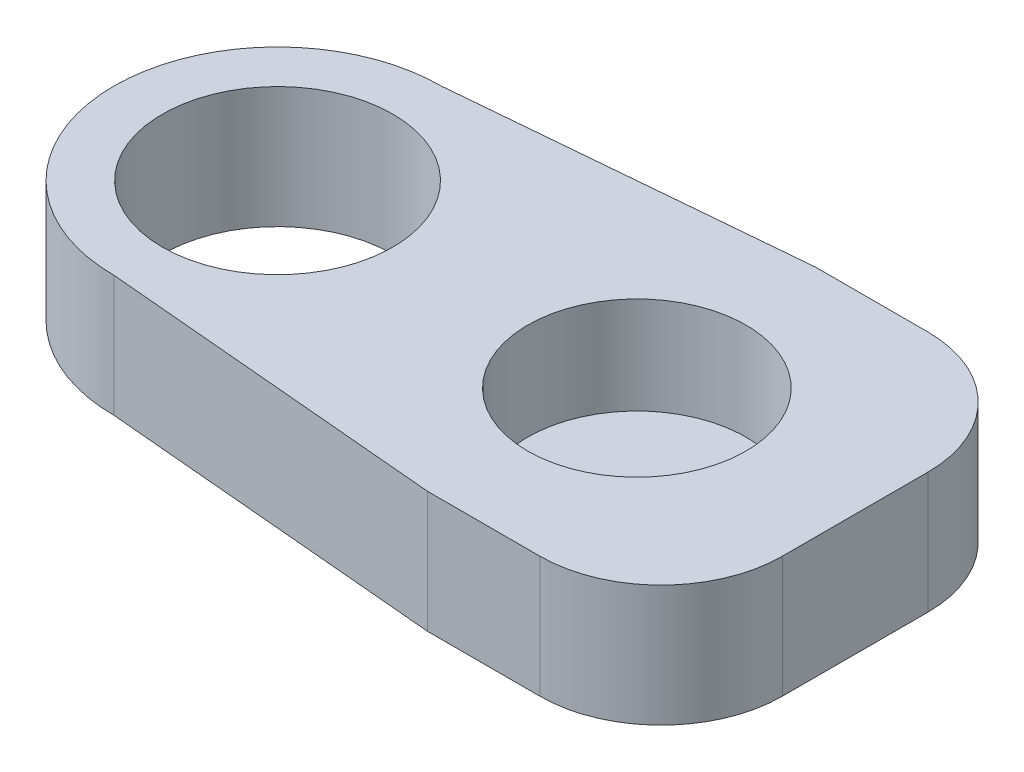
ISO-10303-21;
HEADER;
FILE_DESCRIPTION(('STEP AP214'),'2;1');
FILE_NAME('part.step','',(''),(''),'','','');
FILE_SCHEMA(('AUTOMOTIVE_DESIGN { 1 0 10303 214 1 1 1 1 }'));
ENDSEC;
DATA;
#1=APPLICATION_CONTEXT('core data for automotive mechanical design processes');
#2=APPLICATION_PROTOCOL_DEFINITION('international standard','automotive_design',2000,#1);
#3=PRODUCT_CONTEXT('',#1,'mechanical');
#4=PRODUCT('Part','Part','',(#3));
#5=PRODUCT_RELATED_PRODUCT_CATEGORY('part','',(#4));
#6=PRODUCT_DEFINITION_FORMATION('','',#4);
#7=PRODUCT_DEFINITION_CONTEXT('part definition',#1,'design');
#8=PRODUCT_DEFINITION('design','',#6,#7);
#9=PRODUCT_DEFINITION_SHAPE('','',#8);
#10=(LENGTH_UNIT() NAMED_UNIT(*) SI_UNIT(.MILLI.,.METRE.));
#11=(NAMED_UNIT(*) PLANE_ANGLE_UNIT() SI_UNIT($,.RADIAN.));
#12=(NAMED_UNIT(*) SI_UNIT($,.STERADIAN.) SOLID_ANGLE_UNIT());
#13=UNCERTAINTY_MEASURE_WITH_UNIT(LENGTH_MEASURE(1.E-05),#10,'distance_accuracy_value','');
#14=(GEOMETRIC_REPRESENTATION_CONTEXT(3) GLOBAL_UNCERTAINTY_ASSIGNED_CONTEXT((#13)) GLOBAL_UNIT_ASSIGNED_CONTEXT((#10,
#11,#12)) REPRESENTATION_CONTEXT('',''));
#15=CARTESIAN_POINT('',(0.,0.,0.));
#16=DIRECTION('',(0.,0.,1.));
#17=DIRECTION('',(1.,0.,0.));
#18=AXIS2_PLACEMENT_3D('',#15,#16,#17);
#19=CARTESIAN_POINT('',(-0.656258948967261,5.,-7.44412914173938));
#20=DIRECTION('',(0.0878173312896641,0.,0.996136595214312));
#21=DIRECTION('',(0.996136595214312,0.,-0.0878173312896641));
#22=AXIS2_PLACEMENT_3D('',#19,#20,#21);
#23=PLANE('',#22);
#24=DIRECTION('',(-0.996136595214312,0.,0.0878173312896641));
#25=VECTOR('',#24,1.);
#26=CARTESIAN_POINT('',(-0.656258948967261,0.,-7.44412914173938));
#27=LINE('',#26,#25);
#28=CARTESIAN_POINT('',(5.64913995116722,0.,-8.));
#29=VERTEX_POINT('',#28);
#30=CARTESIAN_POINT('',(-8.52996029853992,0.,-6.75));
#31=VERTEX_POINT('',#30);
#32=EDGE_CURVE('E142',#29,#31,#27,.T.);
#33=ORIENTED_EDGE('',*,*,#32,.T.);
#34=DIRECTION('',(0.,-1.,0.));
#35=VECTOR('',#34,1.);
#36=CARTESIAN_POINT('',(-8.52996029853992,5.,-6.75));
#37=LINE('',#36,#35);
#38=CARTESIAN_POINT('',(-8.52996029853992,5.,-6.75));
#39=VERTEX_POINT('',#38);
#40=EDGE_CURVE('E11',#39,#31,#37,.T.);
#41=ORIENTED_EDGE('',*,*,#40,.F.);
#42=DIRECTION('',(-0.996136595214312,0.,0.0878173312896641));
#43=VECTOR('',#42,1.);
#44=CARTESIAN_POINT('',(-0.656258948967261,5.,-7.44412914173938));
#45=LINE('',#44,#43);
#46=CARTESIAN_POINT('',(5.64913995116722,5.,-8.));
#47=VERTEX_POINT('',#46);
#48=EDGE_CURVE('E169',#47,#39,#45,.T.);
#49=ORIENTED_EDGE('',*,*,#48,.F.);
#50=DIRECTION('',(0.,-1.,0.));
#51=VECTOR('',#50,1.);
#52=CARTESIAN_POINT('',(5.64913995116722,5.,-8.));
#53=LINE('',#52,#51);
#54=EDGE_CURVE('E52',#47,#29,#53,.T.);
#55=ORIENTED_EDGE('',*,*,#54,.T.);
#56=EDGE_LOOP('',(#33,#41,#49,#55));
#57=FACE_BOUND('',#56,.T.);
#58=ADVANCED_FACE('F36',(#57),#23,.F.);
#59=CARTESIAN_POINT('',(-8.52998014926995,5.,1.9850730054085E-05));
#60=DIRECTION('',(0.,-1.,0.));
#61=DIRECTION('',(0.,0.,-1.));
#62=AXIS2_PLACEMENT_3D('',#59,#60,#61);
#63=CYLINDRICAL_SURFACE('',#62,6.75001985075924);
#64=CARTESIAN_POINT('',(-8.52998014926995,0.,1.9850730054085E-05));
#65=DIRECTION('',(0.,1.,0.));
#66=DIRECTION('',(0.,0.,1.));
#67=AXIS2_PLACEMENT_3D('',#64,#65,#66);
#68=CIRCLE('',#67,6.75001985075924);
#69=CARTESIAN_POINT('',(-15.28,0.,0.));
#70=VERTEX_POINT('',#69);
#71=EDGE_CURVE('E144',#31,#70,#68,.T.);
#72=ORIENTED_EDGE('',*,*,#71,.T.);
#73=DIRECTION('',(0.,-1.,0.));
#74=VECTOR('',#73,1.);
#75=CARTESIAN_POINT('',(-15.28,5.,0.));
#76=LINE('',#75,#74);
#77=CARTESIAN_POINT('',(-15.28,5.,0.));
#78=VERTEX_POINT('',#77);
#79=EDGE_CURVE('E44',#78,#70,#76,.T.);
#80=ORIENTED_EDGE('',*,*,#79,.F.);
#81=CARTESIAN_POINT('',(-8.52998014926995,5.,1.9850730054085E-05));
#82=DIRECTION('',(0.,1.,0.));
#83=DIRECTION('',(0.,0.,1.));
#84=AXIS2_PLACEMENT_3D('',#81,#82,#83);
#85=CIRCLE('',#84,6.75001985075924);
#86=EDGE_CURVE('E94',#39,#78,#85,.T.);
#87=ORIENTED_EDGE('',*,*,#86,.F.);
#88=ORIENTED_EDGE('',*,*,#40,.T.);
#89=EDGE_LOOP('',(#72,#80,#87,#88));
#90=FACE_BOUND('',#89,.T.);
#91=ADVANCED_FACE('F184',(#90),#63,.T.);
#92=CARTESIAN_POINT('',(-8.52998014926995,5.,-1.9850730054085E-05));
#93=DIRECTION('',(0.,-1.,0.));
#94=DIRECTION('',(0.,0.,-1.));
#95=AXIS2_PLACEMENT_3D('',#92,#93,#94);
#96=CYLINDRICAL_SURFACE('',#95,6.75001985075924);
#97=CARTESIAN_POINT('',(-8.52998014926995,0.,-1.9850730054085E-05));
#98=DIRECTION('',(0.,1.,0.));
#99=DIRECTION('',(0.,0.,1.));
#100=AXIS2_PLACEMENT_3D('',#97,#98,#99);
#101=CIRCLE('',#100,6.75001985075924);
#102=CARTESIAN_POINT('',(-8.52996029853992,0.,6.75));
#103=VERTEX_POINT('',#102);
#104=EDGE_CURVE('E148',#103,#70,#101,.F.);
#105=ORIENTED_EDGE('',*,*,#104,.F.);
#106=DIRECTION('',(0.,-1.,0.));
#107=VECTOR('',#106,1.);
#108=CARTESIAN_POINT('',(-8.52996029853992,5.,6.75));
#109=LINE('',#108,#107);
#110=CARTESIAN_POINT('',(-8.52996029853992,5.,6.75));
#111=VERTEX_POINT('',#110);
#112=EDGE_CURVE('E177',#111,#103,#109,.T.);
#113=ORIENTED_EDGE('',*,*,#112,.F.);
#114=CARTESIAN_POINT('',(-8.52998014926995,5.,-1.9850730054085E-05));
#115=DIRECTION('',(0.,1.,0.));
#116=DIRECTION('',(0.,0.,1.));
#117=AXIS2_PLACEMENT_3D('',#114,#115,#116);
#118=CIRCLE('',#117,6.75001985075924);
#119=EDGE_CURVE('E183',#111,#78,#118,.F.);
#120=ORIENTED_EDGE('',*,*,#119,.T.);
#121=ORIENTED_EDGE('',*,*,#79,.T.);
#122=EDGE_LOOP('',(#105,#113,#120,#121));
#123=FACE_BOUND('',#122,.T.);
#124=ADVANCED_FACE('F181',(#123),#96,.T.);
#125=CARTESIAN_POINT('',(-0.656258948967261,5.,7.44412914173938));
#126=DIRECTION('',(-0.0878173312896641,0.,0.996136595214312));
#127=DIRECTION('',(0.996136595214312,0.,0.0878173312896641));
#128=AXIS2_PLACEMENT_3D('',#125,#126,#127);
#129=PLANE('',#128);
#130=DIRECTION('',(-0.996136595214312,0.,-0.0878173312896641));
#131=VECTOR('',#130,1.);
#132=CARTESIAN_POINT('',(-0.656258948967261,0.,7.44412914173938));
#133=LINE('',#132,#131);
#134=CARTESIAN_POINT('',(5.64913995116722,0.,8.));
#135=VERTEX_POINT('',#134);
#136=EDGE_CURVE('E151',#135,#103,#133,.T.);
#137=ORIENTED_EDGE('',*,*,#136,.F.);
#138=DIRECTION('',(0.,-1.,0.));
#139=VECTOR('',#138,1.);
#140=CARTESIAN_POINT('',(5.64913995116722,5.,8.));
#141=LINE('',#140,#139);
#142=CARTESIAN_POINT('',(5.64913995116722,5.,8.));
#143=VERTEX_POINT('',#142);
#144=EDGE_CURVE('E175',#143,#135,#141,.T.);
#145=ORIENTED_EDGE('',*,*,#144,.F.);
#146=DIRECTION('',(-0.996136595214312,0.,-0.0878173312896641));
#147=VECTOR('',#146,1.);
#148=CARTESIAN_POINT('',(-0.656258948967261,5.,7.44412914173938));
#149=LINE('',#148,#147);
#150=EDGE_CURVE('E196',#143,#111,#149,.T.);
#151=ORIENTED_EDGE('',*,*,#150,.T.);
#152=ORIENTED_EDGE('',*,*,#112,.T.);
#153=EDGE_LOOP('',(#137,#145,#151,#152));
#154=FACE_BOUND('',#153,.T.);
#155=ADVANCED_FACE('F192',(#154),#129,.T.);
#156=CARTESIAN_POINT('',(0.,5.,8.));
#157=DIRECTION('',(0.,0.,-1.));
#158=DIRECTION('',(-1.,0.,0.));
#159=AXIS2_PLACEMENT_3D('',#156,#157,#158);
#160=PLANE('',#159);
#161=DIRECTION('',(1.,0.,0.));
#162=VECTOR('',#161,1.);
#163=CARTESIAN_POINT('',(0.,0.,8.));
#164=LINE('',#163,#162);
#165=CARTESIAN_POINT('',(10.28,0.,8.));
#166=VERTEX_POINT('',#165);
#167=EDGE_CURVE('E154',#135,#166,#164,.T.);
#168=ORIENTED_EDGE('',*,*,#167,.T.);
#169=DIRECTION('',(0.,-1.,0.));
#170=VECTOR('',#169,1.);
#171=CARTESIAN_POINT('',(10.28,5.,8.));
#172=LINE('',#171,#170);
#173=CARTESIAN_POINT('',(10.28,5.,8.));
#174=VERTEX_POINT('',#173);
#175=EDGE_CURVE('E173',#174,#166,#172,.T.);
#176=ORIENTED_EDGE('',*,*,#175,.F.);
#177=DIRECTION('',(1.,0.,0.));
#178=VECTOR('',#177,1.);
#179=CARTESIAN_POINT('',(0.,5.,8.));
#180=LINE('',#179,#178);
#181=EDGE_CURVE('E198',#143,#174,#180,.T.);
#182=ORIENTED_EDGE('',*,*,#181,.F.);
#183=ORIENTED_EDGE('',*,*,#144,.T.);
#184=EDGE_LOOP('',(#168,#176,#182,#183));
#185=FACE_BOUND('',#184,.T.);
#186=ADVANCED_FACE('F314',(#185),#160,.F.);
#187=CARTESIAN_POINT('',(10.28,5.,3.));
#188=DIRECTION('',(0.,-1.,0.));
#189=DIRECTION('',(0.,0.,-1.));
#190=AXIS2_PLACEMENT_3D('',#187,#188,#189);
#191=CYLINDRICAL_SURFACE('',#190,5.);
#192=CARTESIAN_POINT('',(10.28,0.,3.));
#193=DIRECTION('',(0.,1.,0.));
#194=DIRECTION('',(0.,0.,1.));
#195=AXIS2_PLACEMENT_3D('',#192,#193,#194);
#196=CIRCLE('',#195,5.);
#197=CARTESIAN_POINT('',(15.28,0.,2.99999999999996));
#198=VERTEX_POINT('',#197);
#199=EDGE_CURVE('E157',#198,#166,#196,.F.);
#200=ORIENTED_EDGE('',*,*,#199,.F.);
#201=DIRECTION('',(0.,-1.,0.));
#202=VECTOR('',#201,1.);
#203=CARTESIAN_POINT('',(15.28,5.,2.99999999999996));
#204=LINE('',#203,#202);
#205=CARTESIAN_POINT('',(15.28,5.,2.99999999999996));
#206=VERTEX_POINT('',#205);
#207=EDGE_CURVE('E131',#206,#198,#204,.T.);
#208=ORIENTED_EDGE('',*,*,#207,.F.);
#209=CARTESIAN_POINT('',(10.28,5.,3.));
#210=DIRECTION('',(0.,1.,0.));
#211=DIRECTION('',(0.,0.,1.));
#212=AXIS2_PLACEMENT_3D('',#209,#210,#211);
#213=CIRCLE('',#212,5.);
#214=EDGE_CURVE('E121',#206,#174,#213,.F.);
#215=ORIENTED_EDGE('',*,*,#214,.T.);
#216=ORIENTED_EDGE('',*,*,#175,.T.);
#217=EDGE_LOOP('',(#200,#208,#215,#216));
#218=FACE_BOUND('',#217,.T.);
#219=ADVANCED_FACE('F205',(#218),#191,.T.);
#220=CARTESIAN_POINT('',(15.28,5.,0.));
#221=DIRECTION('',(-1.,0.,0.));
#222=DIRECTION('',(0.,0.,1.));
#223=AXIS2_PLACEMENT_3D('',#220,#221,#222);
#224=PLANE('',#223);
#225=DIRECTION('',(0.,0.,-1.));
#226=VECTOR('',#225,1.);
#227=CARTESIAN_POINT('',(15.28,0.,0.));
#228=LINE('',#227,#226);
#229=CARTESIAN_POINT('',(15.28,0.,-2.99999999999996));
#230=VERTEX_POINT('',#229);
#231=EDGE_CURVE('E128',#198,#230,#228,.T.);
#232=ORIENTED_EDGE('',*,*,#231,.T.);
#233=DIRECTION('',(0.,-1.,0.));
#234=VECTOR('',#233,1.);
#235=CARTESIAN_POINT('',(15.28,5.,-2.99999999999996));
#236=LINE('',#235,#234);
#237=CARTESIAN_POINT('',(15.28,5.,-2.99999999999996));
#238=VERTEX_POINT('',#237);
#239=EDGE_CURVE('E125',#238,#230,#236,.T.);
#240=ORIENTED_EDGE('',*,*,#239,.F.);
#241=DIRECTION('',(0.,0.,-1.));
#242=VECTOR('',#241,1.);
#243=CARTESIAN_POINT('',(15.28,5.,0.));
#244=LINE('',#243,#242);
#245=EDGE_CURVE('E113',#206,#238,#244,.T.);
#246=ORIENTED_EDGE('',*,*,#245,.F.);
#247=ORIENTED_EDGE('',*,*,#207,.T.);
#248=EDGE_LOOP('',(#232,#240,#246,#247));
#249=FACE_BOUND('',#248,.T.);
#250=ADVANCED_FACE('F126',(#249),#224,.F.);
#251=CARTESIAN_POINT('',(10.28,5.,-3.));
#252=DIRECTION('',(0.,-1.,0.));
#253=DIRECTION('',(0.,0.,-1.));
#254=AXIS2_PLACEMENT_3D('',#251,#252,#253);
#255=CYLINDRICAL_SURFACE('',#254,5.);
#256=CARTESIAN_POINT('',(10.28,0.,-3.));
#257=DIRECTION('',(0.,1.,0.));
#258=DIRECTION('',(0.,0.,1.));
#259=AXIS2_PLACEMENT_3D('',#256,#257,#258);
#260=CIRCLE('',#259,5.);
#261=CARTESIAN_POINT('',(10.28,0.,-8.));
#262=VERTEX_POINT('',#261);
#263=EDGE_CURVE('E161',#230,#262,#260,.T.);
#264=ORIENTED_EDGE('',*,*,#263,.T.);
#265=DIRECTION('',(0.,-1.,0.));
#266=VECTOR('',#265,1.);
#267=CARTESIAN_POINT('',(10.28,5.,-8.));
#268=LINE('',#267,#266);
#269=CARTESIAN_POINT('',(10.28,5.,-8.));
#270=VERTEX_POINT('',#269);
#271=EDGE_CURVE('E82',#270,#262,#268,.T.);
#272=ORIENTED_EDGE('',*,*,#271,.F.);
#273=CARTESIAN_POINT('',(10.28,5.,-3.));
#274=DIRECTION('',(0.,1.,0.));
#275=DIRECTION('',(0.,0.,1.));
#276=AXIS2_PLACEMENT_3D('',#273,#274,#275);
#277=CIRCLE('',#276,5.);
#278=EDGE_CURVE('E119',#238,#270,#277,.T.);
#279=ORIENTED_EDGE('',*,*,#278,.F.);
#280=ORIENTED_EDGE('',*,*,#239,.T.);
#281=EDGE_LOOP('',(#264,#272,#279,#280));
#282=FACE_BOUND('',#281,.T.);
#283=ADVANCED_FACE('F133',(#282),#255,.T.);
#284=CARTESIAN_POINT('',(0.,5.,-8.));
#285=DIRECTION('',(0.,0.,-1.));
#286=DIRECTION('',(-1.,0.,0.));
#287=AXIS2_PLACEMENT_3D('',#284,#285,#286);
#288=PLANE('',#287);
#289=DIRECTION('',(1.,0.,0.));
#290=VECTOR('',#289,1.);
#291=CARTESIAN_POINT('',(0.,0.,-8.));
#292=LINE('',#291,#290);
#293=EDGE_CURVE('E163',#29,#262,#292,.T.);
#294=ORIENTED_EDGE('',*,*,#293,.F.);
#295=ORIENTED_EDGE('',*,*,#54,.F.);
#296=DIRECTION('',(1.,0.,0.));
#297=VECTOR('',#296,1.);
#298=CARTESIAN_POINT('',(0.,5.,-8.));
#299=LINE('',#298,#297);
#300=EDGE_CURVE('E134',#47,#270,#299,.T.);
#301=ORIENTED_EDGE('',*,*,#300,.T.);
#302=ORIENTED_EDGE('',*,*,#271,.T.);
#303=EDGE_LOOP('',(#294,#295,#301,#302));
#304=FACE_BOUND('',#303,.T.);
#305=ADVANCED_FACE('F207',(#304),#288,.T.);
#306=CARTESIAN_POINT('',(-8.52996029853992,5.,0.));
#307=DIRECTION('',(0.,-1.,0.));
#308=DIRECTION('',(0.,0.,-1.));
#309=AXIS2_PLACEMENT_3D('',#306,#307,#308);
#310=CYLINDRICAL_SURFACE('',#309,4.75);
#311=CARTESIAN_POINT('',(-8.52996029853992,5.,0.));
#312=DIRECTION('',(0.,1.,0.));
#313=DIRECTION('',(0.,0.,1.));
#314=AXIS2_PLACEMENT_3D('',#311,#312,#313);
#315=CIRCLE('',#314,4.75);
#316=CARTESIAN_POINT('',(-8.52996029853992,5.,4.75));
#317=VERTEX_POINT('',#316);
#318=EDGE_CURVE('E136',#317,#317,#315,.T.);
#319=ORIENTED_EDGE('',*,*,#318,.T.);
#320=EDGE_LOOP('',(#319));
#321=FACE_BOUND('',#320,.T.);
#322=CARTESIAN_POINT('',(-8.52996029853992,0.,0.));
#323=DIRECTION('',(0.,1.,0.));
#324=DIRECTION('',(0.,0.,1.));
#325=AXIS2_PLACEMENT_3D('',#322,#323,#324);
#326=CIRCLE('',#325,4.75);
#327=CARTESIAN_POINT('',(-8.52996029853992,0.,4.75));
#328=VERTEX_POINT('',#327);
#329=EDGE_CURVE('E166',#328,#328,#326,.T.);
#330=ORIENTED_EDGE('',*,*,#329,.F.);
#331=EDGE_LOOP('',(#330));
#332=FACE_BOUND('',#331,.T.);
#333=ADVANCED_FACE('F209',(#321,#332),#310,.F.);
#334=CARTESIAN_POINT('',(0.,5.,0.));
#335=DIRECTION('',(0.,1.,0.));
#336=DIRECTION('',(0.,0.,1.));
#337=AXIS2_PLACEMENT_3D('',#334,#335,#336);
#338=PLANE('',#337);
#339=CARTESIAN_POINT('',(6.28003970146008,5.,0.));
#340=DIRECTION('',(0.,1.,0.));
#341=DIRECTION('',(0.,0.,1.));
#342=AXIS2_PLACEMENT_3D('',#339,#340,#341);
#343=CIRCLE('',#342,4.5);
#344=CARTESIAN_POINT('',(6.28003970146008,5.,4.5));
#345=VERTEX_POINT('',#344);
#346=EDGE_CURVE('E223',#345,#345,#343,.T.);
#347=ORIENTED_EDGE('',*,*,#346,.F.);
#348=EDGE_LOOP('',(#347));
#349=FACE_BOUND('',#348,.T.);
#350=ORIENTED_EDGE('',*,*,#48,.T.);
#351=ORIENTED_EDGE('',*,*,#86,.T.);
#352=ORIENTED_EDGE('',*,*,#119,.F.);
#353=ORIENTED_EDGE('',*,*,#150,.F.);
#354=ORIENTED_EDGE('',*,*,#181,.T.);
#355=ORIENTED_EDGE('',*,*,#214,.F.);
#356=ORIENTED_EDGE('',*,*,#245,.T.);
#357=ORIENTED_EDGE('',*,*,#278,.T.);
#358=ORIENTED_EDGE('',*,*,#300,.F.);
#359=EDGE_LOOP('',(#350,#351,#352,#353,#354,#355,#356,#357,#358));
#360=FACE_BOUND('',#359,.T.);
#361=ORIENTED_EDGE('',*,*,#318,.F.);
#362=EDGE_LOOP('',(#361));
#363=FACE_BOUND('',#362,.T.);
#364=ADVANCED_FACE('F115',(#349,#360,#363),#338,.T.);
#365=CARTESIAN_POINT('',(0.,0.,0.));
#366=DIRECTION('',(0.,1.,0.));
#367=DIRECTION('',(0.,0.,1.));
#368=AXIS2_PLACEMENT_3D('',#365,#366,#367);
#369=PLANE('',#368);
#370=ORIENTED_EDGE('',*,*,#32,.F.);
#371=ORIENTED_EDGE('',*,*,#293,.T.);
#372=ORIENTED_EDGE('',*,*,#263,.F.);
#373=ORIENTED_EDGE('',*,*,#231,.F.);
#374=ORIENTED_EDGE('',*,*,#199,.T.);
#375=ORIENTED_EDGE('',*,*,#167,.F.);
#376=ORIENTED_EDGE('',*,*,#136,.T.);
#377=ORIENTED_EDGE('',*,*,#104,.T.);
#378=ORIENTED_EDGE('',*,*,#71,.F.);
#379=EDGE_LOOP('',(#370,#371,#372,#373,#374,#375,#376,#377,#378));
#380=FACE_BOUND('',#379,.T.);
#381=ORIENTED_EDGE('',*,*,#329,.T.);
#382=EDGE_LOOP('',(#381));
#383=FACE_BOUND('',#382,.T.);
#384=ADVANCED_FACE('F187',(#380,#383),#369,.F.);
#385=CARTESIAN_POINT('',(6.28003970146008,1.,0.));
#386=DIRECTION('',(0.,1.,0.));
#387=DIRECTION('',(0.,0.,1.));
#388=AXIS2_PLACEMENT_3D('',#385,#386,#387);
#389=CYLINDRICAL_SURFACE('',#388,4.5);
#390=CARTESIAN_POINT('',(6.28003970146008,1.,0.));
#391=DIRECTION('',(0.,1.,0.));
#392=DIRECTION('',(0.,0.,1.));
#393=AXIS2_PLACEMENT_3D('',#390,#391,#392);
#394=CIRCLE('',#393,4.5);
#395=CARTESIAN_POINT('',(6.28003970146008,1.,4.5));
#396=VERTEX_POINT('',#395);
#397=EDGE_CURVE('E145',#396,#396,#394,.T.);
#398=ORIENTED_EDGE('',*,*,#397,.F.);
#399=EDGE_LOOP('',(#398));
#400=FACE_BOUND('',#399,.T.);
#401=ORIENTED_EDGE('',*,*,#346,.T.);
#402=EDGE_LOOP('',(#401));
#403=FACE_BOUND('',#402,.T.);
#404=ADVANCED_FACE('F231',(#400,#403),#389,.F.);
#405=CARTESIAN_POINT('',(0.,1.,0.));
#406=DIRECTION('',(0.,1.,0.));
#407=DIRECTION('',(0.,0.,1.));
#408=AXIS2_PLACEMENT_3D('',#405,#406,#407);
#409=PLANE('',#408);
#410=ORIENTED_EDGE('',*,*,#397,.T.);
#411=EDGE_LOOP('',(#410));
#412=FACE_BOUND('',#411,.T.);
#413=ADVANCED_FACE('F229',(#412),#409,.T.);
#414=CLOSED_SHELL('',(#58,#91,#124,#155,#186,#219,#250,#283,#305,#333,#364,#384,#404,#413));
#415=MANIFOLD_SOLID_BREP('B2',#414);
#416=ADVANCED_BREP_SHAPE_REPRESENTATION('',(#18,#415),#14);
#417=SHAPE_DEFINITION_REPRESENTATION(#9,#416);
ENDSEC;
END-ISO-10303-21;
